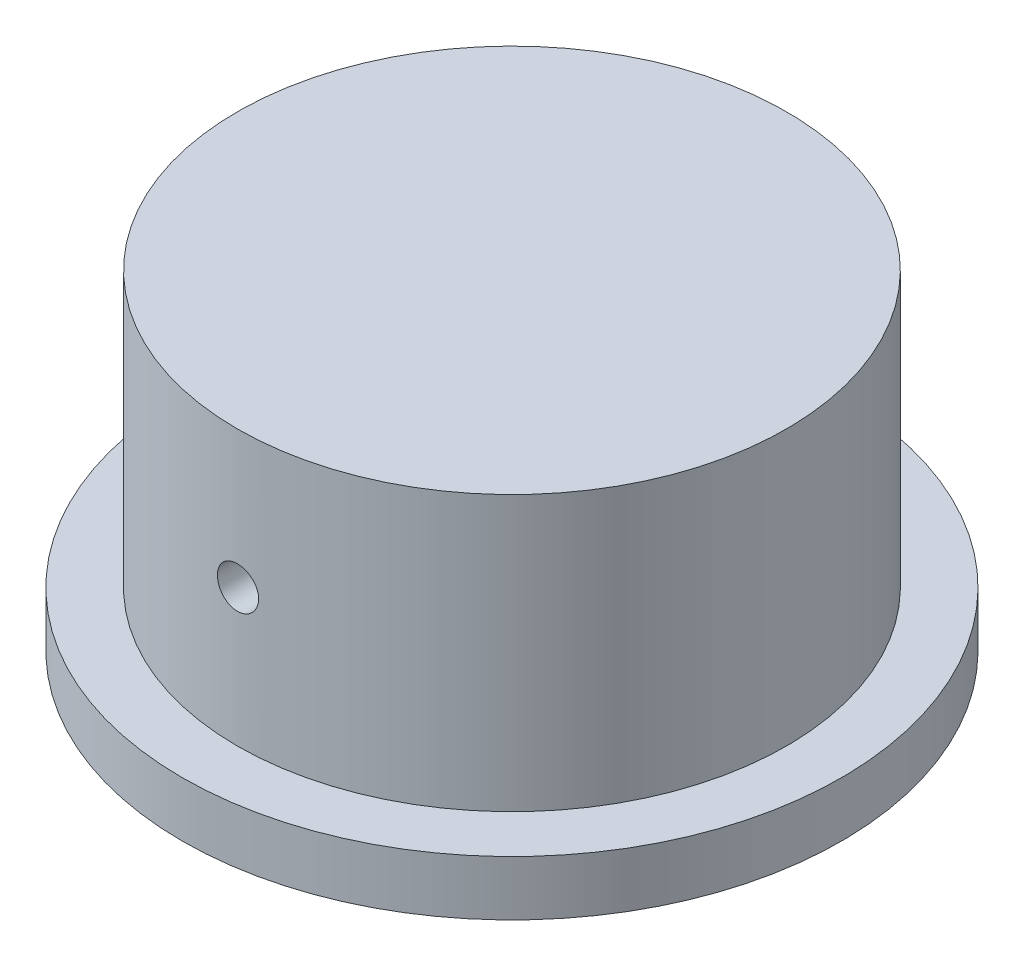
ISO-10303-21;
HEADER;
FILE_DESCRIPTION(('STEP AP214'),'2;1');
FILE_NAME('part.step','',(''),(''),'','','');
FILE_SCHEMA(('AUTOMOTIVE_DESIGN { 1 0 10303 214 1 1 1 1 }'));
ENDSEC;
DATA;
#1=APPLICATION_CONTEXT('core data for automotive mechanical design processes');
#2=APPLICATION_PROTOCOL_DEFINITION('international standard','automotive_design',2000,#1);
#3=PRODUCT_CONTEXT('',#1,'mechanical');
#4=PRODUCT('Part','Part','',(#3));
#5=PRODUCT_RELATED_PRODUCT_CATEGORY('part','',(#4));
#6=PRODUCT_DEFINITION_FORMATION('','',#4);
#7=PRODUCT_DEFINITION_CONTEXT('part definition',#1,'design');
#8=PRODUCT_DEFINITION('design','',#6,#7);
#9=PRODUCT_DEFINITION_SHAPE('','',#8);
#10=(LENGTH_UNIT() NAMED_UNIT(*) SI_UNIT(.MILLI.,.METRE.));
#11=(NAMED_UNIT(*) PLANE_ANGLE_UNIT() SI_UNIT($,.RADIAN.));
#12=(NAMED_UNIT(*) SI_UNIT($,.STERADIAN.) SOLID_ANGLE_UNIT());
#13=UNCERTAINTY_MEASURE_WITH_UNIT(LENGTH_MEASURE(1.E-05),#10,'distance_accuracy_value','');
#14=(GEOMETRIC_REPRESENTATION_CONTEXT(3) GLOBAL_UNCERTAINTY_ASSIGNED_CONTEXT((#13)) GLOBAL_UNIT_ASSIGNED_CONTEXT((#10,
#11,#12)) REPRESENTATION_CONTEXT('',''));
#15=CARTESIAN_POINT('',(0.,0.,0.));
#16=DIRECTION('',(0.,0.,1.));
#17=DIRECTION('',(1.,0.,0.));
#18=AXIS2_PLACEMENT_3D('',#15,#16,#17);
#19=CARTESIAN_POINT('',(0.,2.,0.));
#20=DIRECTION('',(0.,-1.,0.));
#21=DIRECTION('',(0.,0.,-1.));
#22=AXIS2_PLACEMENT_3D('',#19,#20,#21);
#23=CYLINDRICAL_SURFACE('',#22,12.);
#24=CARTESIAN_POINT('',(0.,2.,0.));
#25=DIRECTION('',(0.,1.,0.));
#26=DIRECTION('',(0.,0.,1.));
#27=AXIS2_PLACEMENT_3D('',#24,#25,#26);
#28=CIRCLE('',#27,12.);
#29=CARTESIAN_POINT('',(0.,2.,12.));
#30=VERTEX_POINT('',#29);
#31=EDGE_CURVE('E51',#30,#30,#28,.T.);
#32=ORIENTED_EDGE('',*,*,#31,.F.);
#33=EDGE_LOOP('',(#32));
#34=FACE_BOUND('',#33,.T.);
#35=CARTESIAN_POINT('',(0.,0.,0.));
#36=DIRECTION('',(0.,1.,0.));
#37=DIRECTION('',(0.,0.,1.));
#38=AXIS2_PLACEMENT_3D('',#35,#36,#37);
#39=CIRCLE('',#38,12.);
#40=CARTESIAN_POINT('',(0.,0.,12.));
#41=VERTEX_POINT('',#40);
#42=EDGE_CURVE('E56',#41,#41,#39,.T.);
#43=ORIENTED_EDGE('',*,*,#42,.T.);
#44=EDGE_LOOP('',(#43));
#45=FACE_BOUND('',#44,.T.);
#46=ADVANCED_FACE('F39',(#34,#45),#23,.T.);
#47=CARTESIAN_POINT('',(0.,2.,0.));
#48=DIRECTION('',(0.,1.,0.));
#49=DIRECTION('',(0.,0.,1.));
#50=AXIS2_PLACEMENT_3D('',#47,#48,#49);
#51=PLANE('',#50);
#52=CARTESIAN_POINT('',(0.,2.,0.));
#53=DIRECTION('',(0.,1.,0.));
#54=DIRECTION('',(0.,0.,1.));
#55=AXIS2_PLACEMENT_3D('',#52,#53,#54);
#56=CIRCLE('',#55,10.);
#57=CARTESIAN_POINT('',(0.,2.,10.));
#58=VERTEX_POINT('',#57);
#59=EDGE_CURVE('E10',#58,#58,#56,.T.);
#60=ORIENTED_EDGE('',*,*,#59,.F.);
#61=EDGE_LOOP('',(#60));
#62=FACE_BOUND('',#61,.T.);
#63=ORIENTED_EDGE('',*,*,#31,.T.);
#64=EDGE_LOOP('',(#63));
#65=FACE_BOUND('',#64,.T.);
#66=ADVANCED_FACE('F86',(#62,#65),#51,.T.);
#67=CARTESIAN_POINT('',(0.,0.,0.));
#68=DIRECTION('',(0.,1.,0.));
#69=DIRECTION('',(0.,0.,1.));
#70=AXIS2_PLACEMENT_3D('',#67,#68,#69);
#71=PLANE('',#70);
#72=ORIENTED_EDGE('',*,*,#42,.F.);
#73=EDGE_LOOP('',(#72));
#74=FACE_BOUND('',#73,.T.);
#75=ADVANCED_FACE('F82',(#74),#71,.F.);
#76=CARTESIAN_POINT('',(0.,12.,0.));
#77=DIRECTION('',(0.,-1.,0.));
#78=DIRECTION('',(0.,0.,-1.));
#79=AXIS2_PLACEMENT_3D('',#76,#77,#78);
#80=CYLINDRICAL_SURFACE('',#79,10.);
#81=CARTESIAN_POINT('',(0.,7.75,-10.));
#82=CARTESIAN_POINT('',(-0.0420644047557217,7.74999815659149,-9.99999962913644));
#83=CARTESIAN_POINT('',(-0.0841578005120436,7.7464492732797,-9.9997317545379));
#84=CARTESIAN_POINT('',(-0.167180970985769,7.73234375772836,-9.99868890393989));
#85=CARTESIAN_POINT('',(-0.208109355581497,7.72177909188151,-9.99791334661944));
#86=CARTESIAN_POINT('',(-0.287587982979909,7.69394833594013,-9.99594281342965));
#87=CARTESIAN_POINT('',(-0.326139518467546,7.67668592644575,-9.99474806795054));
#88=CARTESIAN_POINT('',(-0.39978824033901,7.63595602356814,-9.99207331235322));
#89=CARTESIAN_POINT('',(-0.434886185899925,7.61248989810202,-9.99059336514136));
#90=CARTESIAN_POINT('',(-0.500714478766272,7.55996538973125,-9.98751093449452));
#91=CARTESIAN_POINT('',(-0.531436614859261,7.53089672795789,-9.98590822914549));
#92=CARTESIAN_POINT('',(-0.58757082684891,7.46801385132754,-9.98276279192191));
#93=CARTESIAN_POINT('',(-0.612982674521331,7.43419943261297,-9.98122006262731));
#94=CARTESIAN_POINT('',(-0.657801919373829,7.3627362725953,-9.97836676979887));
#95=CARTESIAN_POINT('',(-0.67720223405166,7.32508307748495,-9.977056480886));
#96=CARTESIAN_POINT('',(-0.709402445233911,7.2470423138281,-9.97481880605083));
#97=CARTESIAN_POINT('',(-0.722202438443438,7.2066547853537,-9.9738914145185));
#98=CARTESIAN_POINT('',(-0.74081518828964,7.12437305379972,-9.9725262944501));
#99=CARTESIAN_POINT('',(-0.746641155221085,7.08248185459619,-9.9720876402507));
#100=CARTESIAN_POINT('',(-0.751181272874191,6.99831402336965,-9.97174669462697));
#101=CARTESIAN_POINT('',(-0.749895534054288,6.95603739734324,-9.97184439487202));
#102=CARTESIAN_POINT('',(-0.740259672087843,6.87238909447306,-9.97256428184655));
#103=CARTESIAN_POINT('',(-0.731923878381971,6.83101575651791,-9.97318540469519));
#104=CARTESIAN_POINT('',(-0.708446776134601,6.75025715144221,-9.97488047599021));
#105=CARTESIAN_POINT('',(-0.69330541223668,6.71087190049562,-9.9759544281199));
#106=CARTESIAN_POINT('',(-0.656630835948505,6.63516164188058,-9.97843536768068));
#107=CARTESIAN_POINT('',(-0.635091163632482,6.5988397749116,-9.97984269140157));
#108=CARTESIAN_POINT('',(-0.586236068717116,6.53032166856756,-9.98283147297571));
#109=CARTESIAN_POINT('',(-0.558920551714384,6.49812549663883,-9.98441293367493));
#110=CARTESIAN_POINT('',(-0.499208639216137,6.43868937087821,-9.98757651680734));
#111=CARTESIAN_POINT('',(-0.466799850088157,6.41146186620264,-9.98915863121148));
#112=CARTESIAN_POINT('',(-0.397864687967221,6.36283211821715,-9.99214150760496));
#113=CARTESIAN_POINT('',(-0.361338312859296,6.34142987789936,-9.99354226950117));
#114=CARTESIAN_POINT('',(-0.285196970108167,6.30505908487812,-9.99600480209642));
#115=CARTESIAN_POINT('',(-0.245581754714489,6.29009104887935,-9.99706654556852));
#116=CARTESIAN_POINT('',(-0.164390826387271,6.26702209389758,-9.99873107500663));
#117=CARTESIAN_POINT('',(-0.122815146421286,6.25892105948117,-9.99933386868751));
#118=CARTESIAN_POINT('',(-0.0389914218918753,6.24983159523053,-10.0000115867693));
#119=CARTESIAN_POINT('',(0.00325474741266048,6.24882596267291,-10.0000877878789));
#120=CARTESIAN_POINT('',(0.0873151154965318,6.25391083403485,-9.9997071385682));
#121=CARTESIAN_POINT('',(0.129129317527299,6.26000128450265,-9.99925029216312));
#122=CARTESIAN_POINT('',(0.211090005588252,6.27909118440529,-9.99785576876619));
#123=CARTESIAN_POINT('',(0.251238350823035,6.29208269527933,-9.99691864430056));
#124=CARTESIAN_POINT('',(0.328785163692014,6.32459784681836,-9.99466890454202));
#125=CARTESIAN_POINT('',(0.366183595899699,6.34412157161841,-9.99335628441277));
#126=CARTESIAN_POINT('',(0.43724747968838,6.38919041894894,-9.9904996627918));
#127=CARTESIAN_POINT('',(0.470905660127774,6.41474697835941,-9.98895522387486));
#128=CARTESIAN_POINT('',(0.533460298008509,6.47113946273454,-9.98581008196255));
#129=CARTESIAN_POINT('',(0.562356688367402,6.50197546206163,-9.98420937817492));
#130=CARTESIAN_POINT('',(0.614626174895771,6.56812597006606,-9.98112836879683));
#131=CARTESIAN_POINT('',(0.637988073543827,6.60344933971649,-9.97964831120046));
#132=CARTESIAN_POINT('',(0.67844872236304,6.67752759919077,-9.97697951427165));
#133=CARTESIAN_POINT('',(0.695547524793444,6.71628246037892,-9.9757907725085));
#134=CARTESIAN_POINT('',(0.72297739619229,6.79608340374365,-9.97384047836854));
#135=CARTESIAN_POINT('',(0.733315403364553,6.83712708992636,-9.97307848815762));
#136=CARTESIAN_POINT('',(0.746952846695886,6.92037361550786,-9.97206643262204));
#137=CARTESIAN_POINT('',(0.750252389536941,6.96257643732781,-9.97181635953825));
#138=CARTESIAN_POINT('',(0.749718107765775,7.0468319566237,-9.9718565345813));
#139=CARTESIAN_POINT('',(0.745901880428616,7.08888476744807,-9.97214544979285));
#140=CARTESIAN_POINT('',(0.731280990966988,7.171750541855,-9.97322821847875));
#141=CARTESIAN_POINT('',(0.720476317216923,7.2125635033749,-9.97402207279308));
#142=CARTESIAN_POINT('',(0.69218950136763,7.2917928042109,-9.97602492677799));
#143=CARTESIAN_POINT('',(0.67470757920477,7.33020922241627,-9.97723391277475));
#144=CARTESIAN_POINT('',(0.633564623098413,7.40356447885728,-9.9799308118954));
#145=CARTESIAN_POINT('',(0.609903713405039,7.4385033870009,-9.98141871941042));
#146=CARTESIAN_POINT('',(0.557008544733637,7.50400167498552,-9.98451015395811));
#147=CARTESIAN_POINT('',(0.527761344100004,7.53455059082005,-9.98611394398152));
#148=CARTESIAN_POINT('',(0.464545486726358,7.59031702515542,-9.98925406645788));
#149=CARTESIAN_POINT('',(0.430575683897842,7.61553324575303,-9.99079038241667));
#150=CARTESIAN_POINT('',(0.358825208301918,7.65994558126956,-9.99362470113832));
#151=CARTESIAN_POINT('',(0.321038574133722,7.67913208024552,-9.99492232188758));
#152=CARTESIAN_POINT('',(0.242796958957605,7.71086414222015,-9.99712833597881));
#153=CARTESIAN_POINT('',(0.202345131868833,7.72341740153413,-9.99803718017026));
#154=CARTESIAN_POINT('',(0.134708958362185,7.73830099426347,-9.99912781002897));
#155=CARTESIAN_POINT('',(0.107960596469022,7.74268235939471,-9.9994534077319));
#156=CARTESIAN_POINT('',(0.054145493973995,7.74853245257616,-9.99988962186462));
#157=CARTESIAN_POINT('',(0.0270787540345342,7.75000118668518,-10.0000002387416));
#158=CARTESIAN_POINT('',(0.,7.75,-10.));
#159=B_SPLINE_CURVE_WITH_KNOTS('',3,(#81,#82,#83,#84,#85,#86,#87,#88,#89,#90,#91,#92,#93,#94,
#95,#96,#97,#98,#99,#100,#101,#102,#103,#104,#105,#106,#107,#108,#109,#110,#111,#112,#113,#114,
#115,#116,#117,#118,#119,#120,#121,#122,#123,#124,#125,#126,#127,#128,#129,#130,#131,#132,#133,
#134,#135,#136,#137,#138,#139,#140,#141,#142,#143,#144,#145,#146,#147,#148,#149,#150,#151,#152,
#153,#154,#155,#156,#157,#158),.UNSPECIFIED.,.T.,.F.,(4,2,2,2,2,2,2,2,2,2,2,2,2,2,2,2,2,2,2,2,2,
2,2,2,2,2,2,2,2,2,2,2,2,2,2,2,2,2,4),(0.,0.126094353170702,0.252333343558037,0.378503060068517,
0.504644979372845,0.631020570667202,0.757401592183361,0.883930948606271,1.01045845112212,
1.13674590235185,1.26303139210068,1.38906081808215,1.51509126920395,1.64124939949198,
1.76740959193311,1.89388166818657,2.02035380940183,2.14683610518214,2.27331627476949,
2.39948968888266,2.52566215259152,2.65168978847615,2.77771904766213,2.9039891760597,
3.03026108315503,3.15678632557819,3.28331051225127,3.4097046500346,3.53609687204868,
3.66217694101203,3.78825721971578,3.9143333459235,4.04040693712559,4.16677622314073,
4.29317623036054,4.41977680385855,4.54623016281112,4.62740295242377,4.70857557318191),.UNSPECIFIED.);
#160=CARTESIAN_POINT('',(0.,7.75,-10.));
#161=VERTEX_POINT('',#160);
#162=EDGE_CURVE('E42',#161,#161,#159,.T.);
#163=ORIENTED_EDGE('',*,*,#162,.T.);
#164=EDGE_LOOP('',(#163));
#165=FACE_BOUND('',#164,.T.);
#166=CARTESIAN_POINT('',(0.75,7.,9.97183533758957));
#167=CARTESIAN_POINT('',(0.749998156422004,6.95793578286105,9.97183571235547));
#168=CARTESIAN_POINT('',(0.746449303697195,6.9158425741027,9.97210436099874));
#169=CARTESIAN_POINT('',(0.732343920689904,6.83281979217606,9.97314997711792));
#170=CARTESIAN_POINT('',(0.721779356159144,6.79189160927602,9.9739275273627));
#171=CARTESIAN_POINT('',(0.693948896624596,6.71241340828478,9.97590238458082));
#172=CARTESIAN_POINT('',(0.676686687047651,6.67386209580042,9.9770994606721));
#173=CARTESIAN_POINT('',(0.635957254899259,6.6002137472712,9.97977819798947));
#174=CARTESIAN_POINT('',(0.612491399750996,6.56511595232988,9.98125979648075));
#175=CARTESIAN_POINT('',(0.559967163907116,6.49928748810813,9.98434414908681));
#176=CARTESIAN_POINT('',(0.530898444002647,6.46856507805213,9.98594712380957));
#177=CARTESIAN_POINT('',(0.468015336253385,6.41243033767614,9.98909158106029));
#178=CARTESIAN_POINT('',(0.434200745296522,6.38701823474068,9.99063306095278));
#179=CARTESIAN_POINT('',(0.362737435634401,6.34219872395765,9.99348286977967));
#180=CARTESIAN_POINT('',(0.32508429273075,6.32279835145272,9.99479092479091));
#181=CARTESIAN_POINT('',(0.247043642578325,6.29059801893978,9.99702414103136));
#182=CARTESIAN_POINT('',(0.206656175113915,6.27779796292064,9.99794930783019));
#183=CARTESIAN_POINT('',(0.12437462518352,6.25918508034776,9.99931096998663));
#184=CARTESIAN_POINT('',(0.0824835476768529,6.25335903851102,9.9997483894841));
#185=CARTESIAN_POINT('',(-0.00168404565213153,6.24881872888792,10.0000883958622));
#186=CARTESIAN_POINT('',(-0.0439605555211952,6.25010435144244,9.99999099098958));
#187=CARTESIAN_POINT('',(-0.127609374074955,6.25974003042704,9.99927308957104));
#188=CARTESIAN_POINT('',(-0.168983330205486,6.26807587442106,9.99865364540528));
#189=CARTESIAN_POINT('',(-0.24974314570626,6.29155329194922,9.99696257762218));
#190=CARTESIAN_POINT('',(-0.28912898923231,6.3066949197123,9.99589095040182));
#191=CARTESIAN_POINT('',(-0.364839961924459,6.34337004009167,9.99341430555227));
#192=CARTESIAN_POINT('',(-0.401161980495738,6.36490993069549,9.99200895449707));
#193=CARTESIAN_POINT('',(-0.469680297251522,6.41376549029613,9.98902289393802));
#194=CARTESIAN_POINT('',(-0.501876527899063,6.44108125382154,9.98744218156439));
#195=CARTESIAN_POINT('',(-0.561312371114614,6.50079333982871,9.98427856004214));
#196=CARTESIAN_POINT('',(-0.588539584418746,6.53320200595794,9.98269565506746));
#197=CARTESIAN_POINT('',(-0.637168803328738,6.60213681866439,9.97970998528348));
#198=CARTESIAN_POINT('',(-0.658570805349993,6.63866296777532,9.97830722058503));
#199=CARTESIAN_POINT('',(-0.694941427452074,6.71480425218741,9.9758403341458));
#200=CARTESIAN_POINT('',(-0.709909456736401,6.75441967076486,9.97477624350593));
#201=CARTESIAN_POINT('',(-0.732978335898976,6.83561104030466,9.97310772498969));
#202=CARTESIAN_POINT('',(-0.741079302426007,6.87718695795192,9.9725032893053));
#203=CARTESIAN_POINT('',(-0.750168511047317,6.96101078845373,9.97182372257534));
#204=CARTESIAN_POINT('',(-0.751174020073077,7.00325681904578,9.97174730659316));
#205=CARTESIAN_POINT('',(-0.746088951169792,7.08731687992525,9.9721290367353));
#206=CARTESIAN_POINT('',(-0.739998426687186,7.12913091346403,9.97258717883338));
#207=CARTESIAN_POINT('',(-0.720908550849848,7.21109078667813,9.97398522861165));
#208=CARTESIAN_POINT('',(-0.707917211639425,7.25123850285786,9.97492457754496));
#209=CARTESIAN_POINT('',(-0.675402614394024,7.3287841336869,9.9771787266467));
#210=CARTESIAN_POINT('',(-0.655879271216805,7.36618201248534,9.97849353170903));
#211=CARTESIAN_POINT('',(-0.610810981578098,7.43724552627865,9.98135355683168));
#212=CARTESIAN_POINT('',(-0.585254501194738,7.47090382855099,9.98289921612509));
#213=CARTESIAN_POINT('',(-0.528862105167427,7.5334587491217,9.98604527748086));
#214=CARTESIAN_POINT('',(-0.498026115742087,7.56235530086331,9.98764568030801));
#215=CARTESIAN_POINT('',(-0.431875535832201,7.61462512605393,9.99072469653657));
#216=CARTESIAN_POINT('',(-0.396552082904168,7.63798720034701,9.99220305911604));
#217=CARTESIAN_POINT('',(-0.322473610995096,7.67844815754694,9.99486781312894));
#218=CARTESIAN_POINT('',(-0.283718620665105,7.6955470927407,9.99605420699979));
#219=CARTESIAN_POINT('',(-0.203917766996163,7.7229770541775,9.99800017818886));
#220=CARTESIAN_POINT('',(-0.162874319471613,7.73331507610462,9.99876019657214));
#221=CARTESIAN_POINT('',(-0.0796282964101663,7.74695262985007,9.99976956142239));
#222=CARTESIAN_POINT('',(-0.0374257382428227,7.75025226708207,10.0000189155376));
#223=CARTESIAN_POINT('',(0.046829951114855,7.74971825639462,9.99997887373471));
#224=CARTESIAN_POINT('',(0.0888831948581373,7.74590209271813,9.99969079833452));
#225=CARTESIAN_POINT('',(0.171749850747466,7.73128117808425,9.99861088994931));
#226=CARTESIAN_POINT('',(0.212563260967769,7.72047641627256,9.99781905618188));
#227=CARTESIAN_POINT('',(0.29179344598446,7.69218925972833,9.99582054025137));
#228=CARTESIAN_POINT('',(0.330210298990644,7.67470708304084,9.99461387163448));
#229=CARTESIAN_POINT('',(0.403566318516533,7.63356348362327,9.9919208924614));
#230=CARTESIAN_POINT('',(0.438505555212461,7.60990218561911,9.99043458754985));
#231=CARTESIAN_POINT('',(0.504003812661951,7.55700659462084,9.98734497141789));
#232=CARTESIAN_POINT('',(0.5345524406923,7.52775944844411,9.98574139571112));
#233=CARTESIAN_POINT('',(0.590318319841533,7.46454381773576,9.98260019224687));
#234=CARTESIAN_POINT('',(0.615534272310233,7.43057418648222,9.98106258062594));
#235=CARTESIAN_POINT('',(0.659946324713098,7.35882384585899,9.97822471259044));
#236=CARTESIAN_POINT('',(0.679132759094352,7.32103714439826,9.97692483865875));
#237=CARTESIAN_POINT('',(0.710864681564985,7.24279538553217,9.97471437028936));
#238=CARTESIAN_POINT('',(0.723417866920405,7.20234348244885,9.97380332488969));
#239=CARTESIAN_POINT('',(0.738301247665612,7.13470750742258,9.97270991362477));
#240=CARTESIAN_POINT('',(0.742682517460157,7.10795943499931,9.97238343687959));
#241=CARTESIAN_POINT('',(0.748532483961894,7.05414491267173,9.97194602846226));
#242=CARTESIAN_POINT('',(0.75000118678684,7.02707846343627,9.97183509633737));
#243=CARTESIAN_POINT('',(0.75,7.,9.97183533758957));
#244=B_SPLINE_CURVE_WITH_KNOTS('',3,(#166,#167,#168,#169,#170,#171,#172,#173,#174,#175,#176,
#177,#178,#179,#180,#181,#182,#183,#184,#185,#186,#187,#188,#189,#190,#191,#192,#193,#194,#195,
#196,#197,#198,#199,#200,#201,#202,#203,#204,#205,#206,#207,#208,#209,#210,#211,#212,#213,#214,
#215,#216,#217,#218,#219,#220,#221,#222,#223,#224,#225,#226,#227,#228,#229,#230,#231,#232,#233,
#234,#235,#236,#237,#238,#239,#240,#241,#242,#243),.UNSPECIFIED.,.T.,.F.,(4,2,2,2,2,2,2,2,2,2,2,
2,2,2,2,2,2,2,2,2,2,2,2,2,2,2,2,2,2,2,2,2,2,2,2,2,2,2,4),(0.,0.126093789669521,
0.252332228930397,0.378501302881093,0.504642589480715,0.631018918045008,0.757400656867899,
0.883929742605126,1.01045698774234,1.1367440908708,1.26302924670638,1.3890604312979,
1.51509262013199,1.64125126243537,1.76741196962522,1.8938833070319,2.02035472226386,
2.1468377481941,2.27331862555119,2.39949160279741,2.52566362973065,2.65168948465478,
2.777716982343,2.9039873941283,3.03025957069264,3.15678512042436,3.2833096138517,
3.40970298124725,3.53609445563983,3.66217578254461,3.78825730527236,3.91433471127213,
4.04040957258903,4.16677810892069,4.29317738404832,4.41977826059327,4.54623190422486,
4.62740382366758,4.70857557261107),.UNSPECIFIED.);
#245=CARTESIAN_POINT('',(0.75,7.,9.97183533758957));
#246=VERTEX_POINT('',#245);
#247=EDGE_CURVE('E62',#246,#246,#244,.T.);
#248=ORIENTED_EDGE('',*,*,#247,.T.);
#249=EDGE_LOOP('',(#248));
#250=FACE_BOUND('',#249,.T.);
#251=CARTESIAN_POINT('',(0.,12.,0.));
#252=DIRECTION('',(0.,1.,0.));
#253=DIRECTION('',(0.,0.,1.));
#254=AXIS2_PLACEMENT_3D('',#251,#252,#253);
#255=CIRCLE('',#254,10.);
#256=CARTESIAN_POINT('',(0.,12.,10.));
#257=VERTEX_POINT('',#256);
#258=EDGE_CURVE('E59',#257,#257,#255,.T.);
#259=ORIENTED_EDGE('',*,*,#258,.F.);
#260=EDGE_LOOP('',(#259));
#261=FACE_BOUND('',#260,.T.);
#262=ORIENTED_EDGE('',*,*,#59,.T.);
#263=EDGE_LOOP('',(#262));
#264=FACE_BOUND('',#263,.T.);
#265=ADVANCED_FACE('F67',(#165,#250,#261,#264),#80,.T.);
#266=CARTESIAN_POINT('',(0.,12.,0.));
#267=DIRECTION('',(0.,1.,0.));
#268=DIRECTION('',(0.,0.,1.));
#269=AXIS2_PLACEMENT_3D('',#266,#267,#268);
#270=PLANE('',#269);
#271=ORIENTED_EDGE('',*,*,#258,.T.);
#272=EDGE_LOOP('',(#271));
#273=FACE_BOUND('',#272,.T.);
#274=ADVANCED_FACE('F74',(#273),#270,.T.);
#275=CARTESIAN_POINT('',(0.,7.,-30.));
#276=DIRECTION('',(0.,0.,1.));
#277=DIRECTION('',(1.,0.,0.));
#278=AXIS2_PLACEMENT_3D('',#275,#276,#277);
#279=CYLINDRICAL_SURFACE('',#278,0.75);
#280=ORIENTED_EDGE('',*,*,#247,.F.);
#281=EDGE_LOOP('',(#280));
#282=FACE_BOUND('',#281,.T.);
#283=ORIENTED_EDGE('',*,*,#162,.F.);
#284=EDGE_LOOP('',(#283));
#285=FACE_BOUND('',#284,.T.);
#286=ADVANCED_FACE('F71',(#282,#285),#279,.F.);
#287=CLOSED_SHELL('',(#46,#66,#75,#265,#274,#286));
#288=MANIFOLD_SOLID_BREP('B2',#287);
#289=ADVANCED_BREP_SHAPE_REPRESENTATION('',(#18,#288),#14);
#290=SHAPE_DEFINITION_REPRESENTATION(#9,#289);
ENDSEC;
END-ISO-10303-21;
